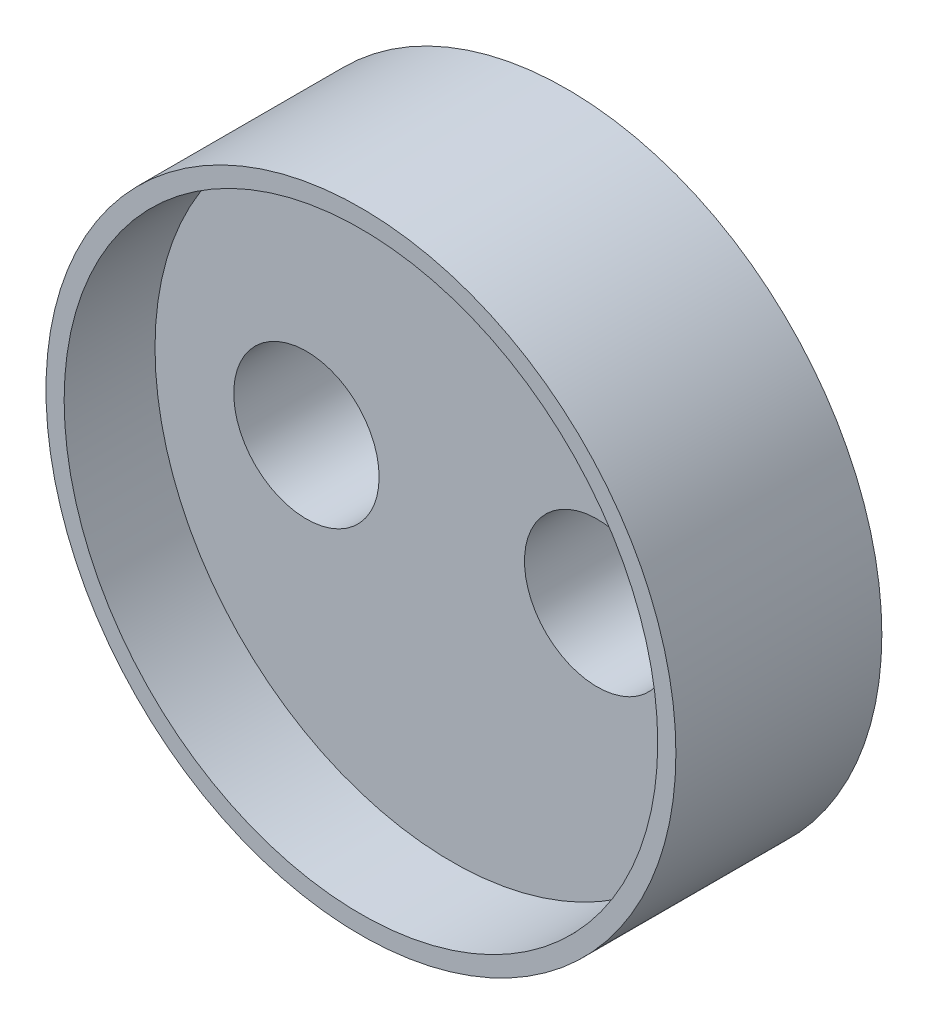
ISO-10303-21;
HEADER;
FILE_DESCRIPTION(('STEP AP214'),'2;1');
FILE_NAME('part.step','',(''),(''),'','','');
FILE_SCHEMA(('AUTOMOTIVE_DESIGN { 1 0 10303 214 1 1 1 1 }'));
ENDSEC;
DATA;
#1=APPLICATION_CONTEXT('core data for automotive mechanical design processes');
#2=APPLICATION_PROTOCOL_DEFINITION('international standard','automotive_design',2000,#1);
#3=PRODUCT_CONTEXT('',#1,'mechanical');
#4=PRODUCT('Part','Part','',(#3));
#5=PRODUCT_RELATED_PRODUCT_CATEGORY('part','',(#4));
#6=PRODUCT_DEFINITION_FORMATION('','',#4);
#7=PRODUCT_DEFINITION_CONTEXT('part definition',#1,'design');
#8=PRODUCT_DEFINITION('design','',#6,#7);
#9=PRODUCT_DEFINITION_SHAPE('','',#8);
#10=(LENGTH_UNIT() NAMED_UNIT(*) SI_UNIT(.MILLI.,.METRE.));
#11=(NAMED_UNIT(*) PLANE_ANGLE_UNIT() SI_UNIT($,.RADIAN.));
#12=(NAMED_UNIT(*) SI_UNIT($,.STERADIAN.) SOLID_ANGLE_UNIT());
#13=UNCERTAINTY_MEASURE_WITH_UNIT(LENGTH_MEASURE(1.E-05),#10,'distance_accuracy_value','');
#14=(GEOMETRIC_REPRESENTATION_CONTEXT(3) GLOBAL_UNCERTAINTY_ASSIGNED_CONTEXT((#13)) GLOBAL_UNIT_ASSIGNED_CONTEXT((#10,
#11,#12)) REPRESENTATION_CONTEXT('',''));
#15=CARTESIAN_POINT('',(0.,0.,0.));
#16=DIRECTION('',(0.,0.,1.));
#17=DIRECTION('',(1.,0.,0.));
#18=AXIS2_PLACEMENT_3D('',#15,#16,#17);
#19=CARTESIAN_POINT('',(0.,0.,9.5));
#20=DIRECTION('',(0.,0.,1.));
#21=DIRECTION('',(1.,0.,0.));
#22=AXIS2_PLACEMENT_3D('',#19,#20,#21);
#23=PLANE('',#22);
#24=CARTESIAN_POINT('',(12.,0.,9.5));
#25=DIRECTION('',(0.,0.,1.));
#26=DIRECTION('',(1.,0.,0.));
#27=AXIS2_PLACEMENT_3D('',#24,#25,#26);
#28=CIRCLE('',#27,6.);
#29=CARTESIAN_POINT('',(18.,0.,9.5));
#30=VERTEX_POINT('',#29);
#31=EDGE_CURVE('E39',#30,#30,#28,.F.);
#32=ORIENTED_EDGE('',*,*,#31,.T.);
#33=EDGE_LOOP('',(#32));
#34=FACE_BOUND('',#33,.T.);
#35=CARTESIAN_POINT('',(-12.,0.,9.5));
#36=DIRECTION('',(0.,0.,1.));
#37=DIRECTION('',(1.,0.,0.));
#38=AXIS2_PLACEMENT_3D('',#35,#36,#37);
#39=CIRCLE('',#38,6.);
#40=CARTESIAN_POINT('',(-6.,0.,9.5));
#41=VERTEX_POINT('',#40);
#42=EDGE_CURVE('E37',#41,#41,#39,.F.);
#43=ORIENTED_EDGE('',*,*,#42,.T.);
#44=EDGE_LOOP('',(#43));
#45=FACE_BOUND('',#44,.T.);
#46=CARTESIAN_POINT('',(0.,0.,9.5));
#47=DIRECTION('',(0.,0.,-1.));
#48=DIRECTION('',(-1.,0.,0.));
#49=AXIS2_PLACEMENT_3D('',#46,#47,#48);
#50=CIRCLE('',#49,24.5);
#51=CARTESIAN_POINT('',(-24.5,0.,9.5));
#52=VERTEX_POINT('',#51);
#53=EDGE_CURVE('E17',#52,#52,#50,.F.);
#54=ORIENTED_EDGE('',*,*,#53,.T.);
#55=EDGE_LOOP('',(#54));
#56=FACE_BOUND('',#55,.T.);
#57=ADVANCED_FACE('F14',(#34,#45,#56),#23,.T.);
#58=CARTESIAN_POINT('',(0.,0.,17.));
#59=DIRECTION('',(0.,0.,-1.));
#60=DIRECTION('',(-1.,0.,0.));
#61=AXIS2_PLACEMENT_3D('',#58,#59,#60);
#62=CYLINDRICAL_SURFACE('',#61,24.5);
#63=ORIENTED_EDGE('',*,*,#53,.F.);
#64=EDGE_LOOP('',(#63));
#65=FACE_BOUND('',#64,.T.);
#66=CARTESIAN_POINT('',(0.,0.,17.));
#67=DIRECTION('',(0.,0.,-1.));
#68=DIRECTION('',(-1.,0.,0.));
#69=AXIS2_PLACEMENT_3D('',#66,#67,#68);
#70=CIRCLE('',#69,24.5);
#71=CARTESIAN_POINT('',(-24.5,0.,17.));
#72=VERTEX_POINT('',#71);
#73=EDGE_CURVE('E34',#72,#72,#70,.T.);
#74=ORIENTED_EDGE('',*,*,#73,.F.);
#75=EDGE_LOOP('',(#74));
#76=FACE_BOUND('',#75,.T.);
#77=ADVANCED_FACE('F47',(#65,#76),#62,.F.);
#78=CARTESIAN_POINT('',(12.,0.,0.));
#79=DIRECTION('',(0.,0.,1.));
#80=DIRECTION('',(1.,0.,0.));
#81=AXIS2_PLACEMENT_3D('',#78,#79,#80);
#82=CYLINDRICAL_SURFACE('',#81,6.);
#83=CARTESIAN_POINT('',(12.,0.,0.));
#84=DIRECTION('',(0.,0.,1.));
#85=DIRECTION('',(1.,0.,0.));
#86=AXIS2_PLACEMENT_3D('',#83,#84,#85);
#87=CIRCLE('',#86,6.);
#88=CARTESIAN_POINT('',(18.,0.,0.));
#89=VERTEX_POINT('',#88);
#90=EDGE_CURVE('E31',#89,#89,#87,.F.);
#91=ORIENTED_EDGE('',*,*,#90,.T.);
#92=EDGE_LOOP('',(#91));
#93=FACE_BOUND('',#92,.T.);
#94=ORIENTED_EDGE('',*,*,#31,.F.);
#95=EDGE_LOOP('',(#94));
#96=FACE_BOUND('',#95,.T.);
#97=ADVANCED_FACE('F50',(#93,#96),#82,.F.);
#98=CARTESIAN_POINT('',(-12.,0.,0.));
#99=DIRECTION('',(0.,0.,1.));
#100=DIRECTION('',(1.,0.,0.));
#101=AXIS2_PLACEMENT_3D('',#98,#99,#100);
#102=CYLINDRICAL_SURFACE('',#101,6.);
#103=CARTESIAN_POINT('',(-12.,0.,0.));
#104=DIRECTION('',(0.,0.,1.));
#105=DIRECTION('',(1.,0.,0.));
#106=AXIS2_PLACEMENT_3D('',#103,#104,#105);
#107=CIRCLE('',#106,6.);
#108=CARTESIAN_POINT('',(-6.,0.,0.));
#109=VERTEX_POINT('',#108);
#110=EDGE_CURVE('E26',#109,#109,#107,.F.);
#111=ORIENTED_EDGE('',*,*,#110,.T.);
#112=EDGE_LOOP('',(#111));
#113=FACE_BOUND('',#112,.T.);
#114=ORIENTED_EDGE('',*,*,#42,.F.);
#115=EDGE_LOOP('',(#114));
#116=FACE_BOUND('',#115,.T.);
#117=ADVANCED_FACE('F57',(#113,#116),#102,.F.);
#118=CARTESIAN_POINT('',(0.,0.,17.));
#119=DIRECTION('',(0.,0.,1.));
#120=DIRECTION('',(1.,0.,0.));
#121=AXIS2_PLACEMENT_3D('',#118,#119,#120);
#122=PLANE('',#121);
#123=ORIENTED_EDGE('',*,*,#73,.T.);
#124=EDGE_LOOP('',(#123));
#125=FACE_BOUND('',#124,.T.);
#126=CARTESIAN_POINT('',(0.,0.,17.));
#127=DIRECTION('',(0.,0.,1.));
#128=DIRECTION('',(1.,0.,0.));
#129=AXIS2_PLACEMENT_3D('',#126,#127,#128);
#130=CIRCLE('',#129,26.);
#131=CARTESIAN_POINT('',(26.,0.,17.));
#132=VERTEX_POINT('',#131);
#133=EDGE_CURVE('E21',#132,#132,#130,.F.);
#134=ORIENTED_EDGE('',*,*,#133,.F.);
#135=EDGE_LOOP('',(#134));
#136=FACE_BOUND('',#135,.T.);
#137=ADVANCED_FACE('F53',(#125,#136),#122,.T.);
#138=CARTESIAN_POINT('',(0.,0.,0.));
#139=DIRECTION('',(0.,0.,1.));
#140=DIRECTION('',(1.,0.,0.));
#141=AXIS2_PLACEMENT_3D('',#138,#139,#140);
#142=PLANE('',#141);
#143=ORIENTED_EDGE('',*,*,#110,.F.);
#144=EDGE_LOOP('',(#143));
#145=FACE_BOUND('',#144,.T.);
#146=ORIENTED_EDGE('',*,*,#90,.F.);
#147=EDGE_LOOP('',(#146));
#148=FACE_BOUND('',#147,.T.);
#149=CARTESIAN_POINT('',(0.,0.,0.));
#150=DIRECTION('',(0.,0.,1.));
#151=DIRECTION('',(1.,0.,0.));
#152=AXIS2_PLACEMENT_3D('',#149,#150,#151);
#153=CIRCLE('',#152,26.);
#154=CARTESIAN_POINT('',(26.,0.,0.));
#155=VERTEX_POINT('',#154);
#156=EDGE_CURVE('E10',#155,#155,#153,.T.);
#157=ORIENTED_EDGE('',*,*,#156,.F.);
#158=EDGE_LOOP('',(#157));
#159=FACE_BOUND('',#158,.T.);
#160=ADVANCED_FACE('F56',(#145,#148,#159),#142,.F.);
#161=CARTESIAN_POINT('',(0.,0.,0.));
#162=DIRECTION('',(0.,0.,1.));
#163=DIRECTION('',(1.,0.,0.));
#164=AXIS2_PLACEMENT_3D('',#161,#162,#163);
#165=CYLINDRICAL_SURFACE('',#164,26.);
#166=ORIENTED_EDGE('',*,*,#156,.T.);
#167=EDGE_LOOP('',(#166));
#168=FACE_BOUND('',#167,.T.);
#169=ORIENTED_EDGE('',*,*,#133,.T.);
#170=EDGE_LOOP('',(#169));
#171=FACE_BOUND('',#170,.T.);
#172=ADVANCED_FACE('F61',(#168,#171),#165,.T.);
#173=CLOSED_SHELL('',(#57,#77,#97,#117,#137,#160,#172));
#174=MANIFOLD_SOLID_BREP('B1',#173);
#175=ADVANCED_BREP_SHAPE_REPRESENTATION('',(#18,#174),#14);
#176=SHAPE_DEFINITION_REPRESENTATION(#9,#175);
ENDSEC;
END-ISO-10303-21;
